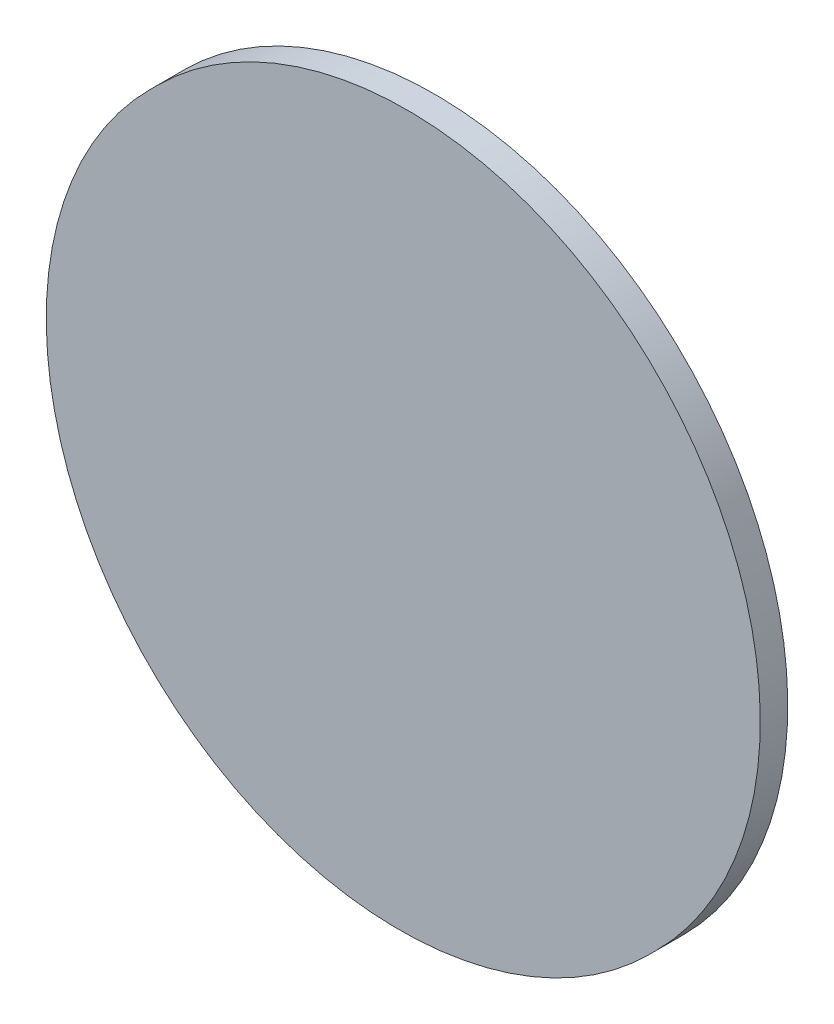
ISO-10303-21;
HEADER;
FILE_DESCRIPTION(('STEP AP214'),'2;1');
FILE_NAME('part.step','',(''),(''),'','','');
FILE_SCHEMA(('AUTOMOTIVE_DESIGN { 1 0 10303 214 1 1 1 1 }'));
ENDSEC;
DATA;
#1=APPLICATION_CONTEXT('core data for automotive mechanical design processes');
#2=APPLICATION_PROTOCOL_DEFINITION('international standard','automotive_design',2000,#1);
#3=PRODUCT_CONTEXT('',#1,'mechanical');
#4=PRODUCT('Part','Part','',(#3));
#5=PRODUCT_RELATED_PRODUCT_CATEGORY('part','',(#4));
#6=PRODUCT_DEFINITION_FORMATION('','',#4);
#7=PRODUCT_DEFINITION_CONTEXT('part definition',#1,'design');
#8=PRODUCT_DEFINITION('design','',#6,#7);
#9=PRODUCT_DEFINITION_SHAPE('','',#8);
#10=(LENGTH_UNIT() NAMED_UNIT(*) SI_UNIT(.MILLI.,.METRE.));
#11=(NAMED_UNIT(*) PLANE_ANGLE_UNIT() SI_UNIT($,.RADIAN.));
#12=(NAMED_UNIT(*) SI_UNIT($,.STERADIAN.) SOLID_ANGLE_UNIT());
#13=UNCERTAINTY_MEASURE_WITH_UNIT(LENGTH_MEASURE(1.E-05),#10,'distance_accuracy_value','');
#14=(GEOMETRIC_REPRESENTATION_CONTEXT(3) GLOBAL_UNCERTAINTY_ASSIGNED_CONTEXT((#13)) GLOBAL_UNIT_ASSIGNED_CONTEXT((#10,
#11,#12)) REPRESENTATION_CONTEXT('',''));
#15=CARTESIAN_POINT('',(0.,0.,0.));
#16=DIRECTION('',(0.,0.,1.));
#17=DIRECTION('',(1.,0.,0.));
#18=AXIS2_PLACEMENT_3D('',#15,#16,#17);
#19=CARTESIAN_POINT('',(168.908198,-116.858198,1.635));
#20=DIRECTION('',(0.,0.,1.));
#21=DIRECTION('',(1.,0.,0.));
#22=AXIS2_PLACEMENT_3D('',#19,#20,#21);
#23=PLANE('',#22);
#24=DIRECTION('',(0.707106781186048,0.707106781187048,0.));
#25=VECTOR('',#24,1.);
#26=CARTESIAN_POINT('',(168.908198,-116.858198,1.635));
#27=LINE('',#26,#25);
#28=CARTESIAN_POINT('',(168.908198,-116.858198,1.635));
#29=VERTEX_POINT('',#28);
#30=CARTESIAN_POINT('',(168.918198,-116.848198,1.635));
#31=VERTEX_POINT('',#30);
#32=EDGE_CURVE('E92',#29,#31,#27,.T.);
#33=ORIENTED_EDGE('',*,*,#32,.T.);
#34=CARTESIAN_POINT('',(168.5999995,-116.5299995,1.635));
#35=DIRECTION('',(0.,0.,1.));
#36=DIRECTION('',(0.707106781186548,-0.707106781186548,0.));
#37=AXIS2_PLACEMENT_3D('',#34,#35,#36);
#38=CIRCLE('',#37,0.450000634227);
#39=CARTESIAN_POINT('',(168.281801,-116.211801,1.635));
#40=VERTEX_POINT('',#39);
#41=EDGE_CURVE('E72',#31,#40,#38,.T.);
#42=ORIENTED_EDGE('',*,*,#41,.T.);
#43=DIRECTION('',(-0.707106781186048,-0.707106781187048,0.));
#44=VECTOR('',#43,1.);
#45=CARTESIAN_POINT('',(168.281801,-116.211801,1.635));
#46=LINE('',#45,#44);
#47=CARTESIAN_POINT('',(168.271801,-116.221801,1.635));
#48=VERTEX_POINT('',#47);
#49=EDGE_CURVE('E86',#40,#48,#46,.T.);
#50=ORIENTED_EDGE('',*,*,#49,.T.);
#51=CARTESIAN_POINT('',(168.5899995,-116.5399995,1.635));
#52=DIRECTION('',(0.,0.,1.));
#53=DIRECTION('',(-0.707106781186548,0.707106781186548,0.));
#54=AXIS2_PLACEMENT_3D('',#51,#52,#53);
#55=CIRCLE('',#54,0.450000634227);
#56=EDGE_CURVE('E11',#48,#29,#55,.T.);
#57=ORIENTED_EDGE('',*,*,#56,.T.);
#58=EDGE_LOOP('',(#33,#42,#50,#57));
#59=FACE_BOUND('',#58,.T.);
#60=ADVANCED_FACE('F17',(#59),#23,.T.);
#61=CARTESIAN_POINT('',(168.908198,-116.858198,1.6));
#62=DIRECTION('',(0.,0.,1.));
#63=DIRECTION('',(1.,0.,0.));
#64=AXIS2_PLACEMENT_3D('',#61,#62,#63);
#65=PLANE('',#64);
#66=CARTESIAN_POINT('',(168.5899995,-116.5399995,1.6));
#67=DIRECTION('',(0.,0.,1.));
#68=DIRECTION('',(-0.707106781186548,0.707106781186548,0.));
#69=AXIS2_PLACEMENT_3D('',#66,#67,#68);
#70=CIRCLE('',#69,0.450000634227);
#71=CARTESIAN_POINT('',(168.271801,-116.221801,1.6));
#72=VERTEX_POINT('',#71);
#73=CARTESIAN_POINT('',(168.908198,-116.858198,1.6));
#74=VERTEX_POINT('',#73);
#75=EDGE_CURVE('E25',#72,#74,#70,.T.);
#76=ORIENTED_EDGE('',*,*,#75,.F.);
#77=DIRECTION('',(-0.707106781186048,-0.707106781187048,0.));
#78=VECTOR('',#77,1.);
#79=CARTESIAN_POINT('',(168.281801,-116.211801,1.6));
#80=LINE('',#79,#78);
#81=CARTESIAN_POINT('',(168.281801,-116.211801,1.6));
#82=VERTEX_POINT('',#81);
#83=EDGE_CURVE('E57',#82,#72,#80,.T.);
#84=ORIENTED_EDGE('',*,*,#83,.F.);
#85=CARTESIAN_POINT('',(168.5999995,-116.5299995,1.6));
#86=DIRECTION('',(0.,0.,1.));
#87=DIRECTION('',(0.707106781186548,-0.707106781186548,0.));
#88=AXIS2_PLACEMENT_3D('',#85,#86,#87);
#89=CIRCLE('',#88,0.450000634227);
#90=CARTESIAN_POINT('',(168.918198,-116.848198,1.6));
#91=VERTEX_POINT('',#90);
#92=EDGE_CURVE('E94',#91,#82,#89,.T.);
#93=ORIENTED_EDGE('',*,*,#92,.F.);
#94=DIRECTION('',(0.707106781186048,0.707106781187048,0.));
#95=VECTOR('',#94,1.);
#96=CARTESIAN_POINT('',(168.908198,-116.858198,1.6));
#97=LINE('',#96,#95);
#98=EDGE_CURVE('E91',#74,#91,#97,.T.);
#99=ORIENTED_EDGE('',*,*,#98,.F.);
#100=EDGE_LOOP('',(#76,#84,#93,#99));
#101=FACE_BOUND('',#100,.T.);
#102=ADVANCED_FACE('F96',(#101),#65,.F.);
#103=CARTESIAN_POINT('',(168.5899995,-116.5399995,1.6));
#104=DIRECTION('',(0.,0.,-1.));
#105=DIRECTION('',(-0.707106781186548,0.707106781186548,0.));
#106=AXIS2_PLACEMENT_3D('',#103,#104,#105);
#107=CYLINDRICAL_SURFACE('',#106,0.450000634227);
#108=ORIENTED_EDGE('',*,*,#75,.T.);
#109=DIRECTION('',(0.,0.,1.));
#110=VECTOR('',#109,1.);
#111=CARTESIAN_POINT('',(168.908198,-116.858198,1.6));
#112=LINE('',#111,#110);
#113=EDGE_CURVE('E81',#74,#29,#112,.T.);
#114=ORIENTED_EDGE('',*,*,#113,.T.);
#115=ORIENTED_EDGE('',*,*,#56,.F.);
#116=DIRECTION('',(0.,0.,1.));
#117=VECTOR('',#116,1.);
#118=CARTESIAN_POINT('',(168.271801,-116.221801,1.6));
#119=LINE('',#118,#117);
#120=EDGE_CURVE('E84',#72,#48,#119,.T.);
#121=ORIENTED_EDGE('',*,*,#120,.F.);
#122=EDGE_LOOP('',(#108,#114,#115,#121));
#123=FACE_BOUND('',#122,.T.);
#124=ADVANCED_FACE('F80',(#123),#107,.T.);
#125=CARTESIAN_POINT('',(168.281801,-116.211801,1.6));
#126=DIRECTION('',(0.707106781187048,-0.707106781186048,0.));
#127=DIRECTION('',(0.,0.,-1.));
#128=AXIS2_PLACEMENT_3D('',#125,#126,#127);
#129=PLANE('',#128);
#130=ORIENTED_EDGE('',*,*,#83,.T.);
#131=ORIENTED_EDGE('',*,*,#120,.T.);
#132=ORIENTED_EDGE('',*,*,#49,.F.);
#133=DIRECTION('',(0.,0.,1.));
#134=VECTOR('',#133,1.);
#135=CARTESIAN_POINT('',(168.281801,-116.211801,1.6));
#136=LINE('',#135,#134);
#137=EDGE_CURVE('E108',#82,#40,#136,.T.);
#138=ORIENTED_EDGE('',*,*,#137,.F.);
#139=EDGE_LOOP('',(#130,#131,#132,#138));
#140=FACE_BOUND('',#139,.T.);
#141=ADVANCED_FACE('F124',(#140),#129,.F.);
#142=CARTESIAN_POINT('',(168.5999995,-116.5299995,1.6));
#143=DIRECTION('',(0.,0.,-1.));
#144=DIRECTION('',(0.707106781186548,-0.707106781186548,0.));
#145=AXIS2_PLACEMENT_3D('',#142,#143,#144);
#146=CYLINDRICAL_SURFACE('',#145,0.450000634227);
#147=ORIENTED_EDGE('',*,*,#92,.T.);
#148=ORIENTED_EDGE('',*,*,#137,.T.);
#149=ORIENTED_EDGE('',*,*,#41,.F.);
#150=DIRECTION('',(0.,0.,1.));
#151=VECTOR('',#150,1.);
#152=CARTESIAN_POINT('',(168.918198,-116.848198,1.6));
#153=LINE('',#152,#151);
#154=EDGE_CURVE('E99',#91,#31,#153,.T.);
#155=ORIENTED_EDGE('',*,*,#154,.F.);
#156=EDGE_LOOP('',(#147,#148,#149,#155));
#157=FACE_BOUND('',#156,.T.);
#158=ADVANCED_FACE('F125',(#157),#146,.T.);
#159=CARTESIAN_POINT('',(168.908198,-116.858198,1.6));
#160=DIRECTION('',(-0.707106781187048,0.707106781186048,0.));
#161=DIRECTION('',(0.,0.,1.));
#162=AXIS2_PLACEMENT_3D('',#159,#160,#161);
#163=PLANE('',#162);
#164=ORIENTED_EDGE('',*,*,#98,.T.);
#165=ORIENTED_EDGE('',*,*,#154,.T.);
#166=ORIENTED_EDGE('',*,*,#32,.F.);
#167=ORIENTED_EDGE('',*,*,#113,.F.);
#168=EDGE_LOOP('',(#164,#165,#166,#167));
#169=FACE_BOUND('',#168,.T.);
#170=ADVANCED_FACE('F89',(#169),#163,.F.);
#171=CLOSED_SHELL('',(#60,#102,#124,#141,#158,#170));
#172=MANIFOLD_SOLID_BREP('B1',#171);
#173=ADVANCED_BREP_SHAPE_REPRESENTATION('',(#18,#172),#14);
#174=SHAPE_DEFINITION_REPRESENTATION(#9,#173);
ENDSEC;
END-ISO-10303-21;
